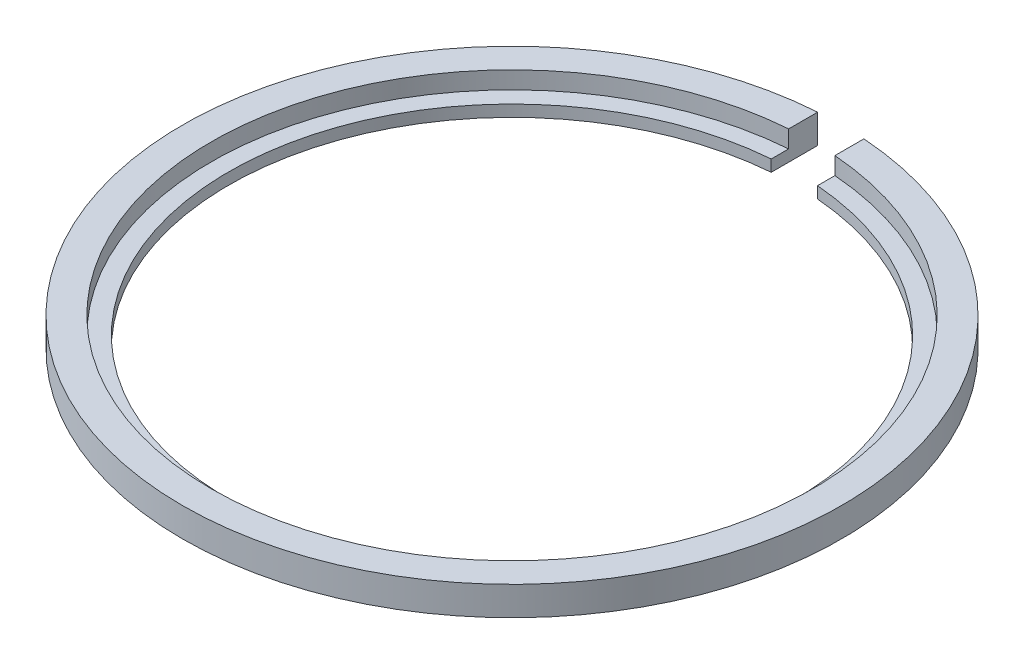
ISO-10303-21;
HEADER;
FILE_DESCRIPTION(('STEP AP214'),'2;1');
FILE_NAME('part.step','',(''),(''),'','','');
FILE_SCHEMA(('AUTOMOTIVE_DESIGN { 1 0 10303 214 1 1 1 1 }'));
ENDSEC;
DATA;
#1=APPLICATION_CONTEXT('core data for automotive mechanical design processes');
#2=APPLICATION_PROTOCOL_DEFINITION('international standard','automotive_design',2000,#1);
#3=PRODUCT_CONTEXT('',#1,'mechanical');
#4=PRODUCT('Part','Part','',(#3));
#5=PRODUCT_RELATED_PRODUCT_CATEGORY('part','',(#4));
#6=PRODUCT_DEFINITION_FORMATION('','',#4);
#7=PRODUCT_DEFINITION_CONTEXT('part definition',#1,'design');
#8=PRODUCT_DEFINITION('design','',#6,#7);
#9=PRODUCT_DEFINITION_SHAPE('','',#8);
#10=(LENGTH_UNIT() NAMED_UNIT(*) SI_UNIT(.MILLI.,.METRE.));
#11=(NAMED_UNIT(*) PLANE_ANGLE_UNIT() SI_UNIT($,.RADIAN.));
#12=(NAMED_UNIT(*) SI_UNIT($,.STERADIAN.) SOLID_ANGLE_UNIT());
#13=UNCERTAINTY_MEASURE_WITH_UNIT(LENGTH_MEASURE(1.E-05),#10,'distance_accuracy_value','');
#14=(GEOMETRIC_REPRESENTATION_CONTEXT(3) GLOBAL_UNCERTAINTY_ASSIGNED_CONTEXT((#13)) GLOBAL_UNIT_ASSIGNED_CONTEXT((#10,
#11,#12)) REPRESENTATION_CONTEXT('',''));
#15=CARTESIAN_POINT('',(0.,0.,0.));
#16=DIRECTION('',(0.,0.,1.));
#17=DIRECTION('',(1.,0.,0.));
#18=AXIS2_PLACEMENT_3D('',#15,#16,#17);
#19=CARTESIAN_POINT('',(0.,27.2585381463305,0.));
#20=DIRECTION('',(0.,1.,0.));
#21=DIRECTION('',(0.,0.,1.));
#22=AXIS2_PLACEMENT_3D('',#19,#20,#21);
#23=CYLINDRICAL_SURFACE('',#22,24.5);
#24=CARTESIAN_POINT('',(0.,0.,0.));
#25=DIRECTION('',(0.,1.,0.));
#26=DIRECTION('',(0.,0.,1.));
#27=AXIS2_PLACEMENT_3D('',#24,#25,#26);
#28=CIRCLE('',#27,24.5);
#29=CARTESIAN_POINT('',(-2.00000000000002,0.,-24.4182308941496));
#30=VERTEX_POINT('',#29);
#31=CARTESIAN_POINT('',(2.,0.,-24.4182308941496));
#32=VERTEX_POINT('',#31);
#33=EDGE_CURVE('E98',#30,#32,#28,.T.);
#34=ORIENTED_EDGE('',*,*,#33,.F.);
#35=DIRECTION('',(0.,1.,0.));
#36=VECTOR('',#35,1.);
#37=CARTESIAN_POINT('',(-2.00000000000002,27.2585381463305,-24.4182308941496));
#38=LINE('',#37,#36);
#39=CARTESIAN_POINT('',(-2.00000000000002,1.,-24.4182308941496));
#40=VERTEX_POINT('',#39);
#41=EDGE_CURVE('E122',#30,#40,#38,.T.);
#42=ORIENTED_EDGE('',*,*,#41,.T.);
#43=CARTESIAN_POINT('',(0.,1.,0.));
#44=DIRECTION('',(0.,1.,0.));
#45=DIRECTION('',(0.,0.,1.));
#46=AXIS2_PLACEMENT_3D('',#43,#44,#45);
#47=CIRCLE('',#46,24.5);
#48=CARTESIAN_POINT('',(2.,1.,-24.4182308941496));
#49=VERTEX_POINT('',#48);
#50=EDGE_CURVE('E100',#40,#49,#47,.T.);
#51=ORIENTED_EDGE('',*,*,#50,.T.);
#52=DIRECTION('',(0.,1.,0.));
#53=VECTOR('',#52,1.);
#54=CARTESIAN_POINT('',(2.,27.2585381463305,-24.4182308941496));
#55=LINE('',#54,#53);
#56=EDGE_CURVE('E55',#32,#49,#55,.T.);
#57=ORIENTED_EDGE('',*,*,#56,.F.);
#58=EDGE_LOOP('',(#34,#42,#51,#57));
#59=FACE_BOUND('',#58,.T.);
#60=ADVANCED_FACE('F34',(#59),#23,.F.);
#61=CARTESIAN_POINT('',(24.5,0.,0.));
#62=DIRECTION('',(0.,1.,0.));
#63=DIRECTION('',(0.,0.,1.));
#64=AXIS2_PLACEMENT_3D('',#61,#62,#63);
#65=PLANE('',#64);
#66=CARTESIAN_POINT('',(0.,0.,0.));
#67=DIRECTION('',(0.,1.,0.));
#68=DIRECTION('',(0.,0.,1.));
#69=AXIS2_PLACEMENT_3D('',#66,#67,#68);
#70=CIRCLE('',#69,28.5);
#71=CARTESIAN_POINT('',(-2.00000000000002,0.,-28.429737951659));
#72=VERTEX_POINT('',#71);
#73=CARTESIAN_POINT('',(2.,0.,-28.429737951659));
#74=VERTEX_POINT('',#73);
#75=EDGE_CURVE('E105',#72,#74,#70,.T.);
#76=ORIENTED_EDGE('',*,*,#75,.F.);
#77=DIRECTION('',(0.,0.,-1.));
#78=VECTOR('',#77,1.);
#79=CARTESIAN_POINT('',(-2.00000000000002,0.,0.));
#80=LINE('',#79,#78);
#81=EDGE_CURVE('E92',#30,#72,#80,.T.);
#82=ORIENTED_EDGE('',*,*,#81,.F.);
#83=ORIENTED_EDGE('',*,*,#33,.T.);
#84=DIRECTION('',(0.,0.,-1.));
#85=VECTOR('',#84,1.);
#86=CARTESIAN_POINT('',(2.00000000000002,0.,0.));
#87=LINE('',#86,#85);
#88=EDGE_CURVE('E83',#32,#74,#87,.T.);
#89=ORIENTED_EDGE('',*,*,#88,.T.);
#90=EDGE_LOOP('',(#76,#82,#83,#89));
#91=FACE_BOUND('',#90,.T.);
#92=ADVANCED_FACE('F104',(#91),#65,.F.);
#93=CARTESIAN_POINT('',(0.,27.2585381463305,0.));
#94=DIRECTION('',(0.,1.,0.));
#95=DIRECTION('',(0.,0.,1.));
#96=AXIS2_PLACEMENT_3D('',#93,#94,#95);
#97=CYLINDRICAL_SURFACE('',#96,28.5);
#98=CARTESIAN_POINT('',(0.,2.5,0.));
#99=DIRECTION('',(0.,1.,0.));
#100=DIRECTION('',(0.,0.,1.));
#101=AXIS2_PLACEMENT_3D('',#98,#99,#100);
#102=CIRCLE('',#101,28.5);
#103=CARTESIAN_POINT('',(-2.00000000000002,2.5,-28.429737951659));
#104=VERTEX_POINT('',#103);
#105=CARTESIAN_POINT('',(2.,2.5,-28.429737951659));
#106=VERTEX_POINT('',#105);
#107=EDGE_CURVE('E107',#104,#106,#102,.T.);
#108=ORIENTED_EDGE('',*,*,#107,.F.);
#109=DIRECTION('',(0.,1.,0.));
#110=VECTOR('',#109,1.);
#111=CARTESIAN_POINT('',(-2.00000000000002,27.2585381463305,-28.429737951659));
#112=LINE('',#111,#110);
#113=EDGE_CURVE('E119',#104,#72,#112,.F.);
#114=ORIENTED_EDGE('',*,*,#113,.T.);
#115=ORIENTED_EDGE('',*,*,#75,.T.);
#116=DIRECTION('',(0.,1.,0.));
#117=VECTOR('',#116,1.);
#118=CARTESIAN_POINT('',(2.,27.2585381463305,-28.429737951659));
#119=LINE('',#118,#117);
#120=EDGE_CURVE('E86',#106,#74,#119,.F.);
#121=ORIENTED_EDGE('',*,*,#120,.F.);
#122=EDGE_LOOP('',(#108,#114,#115,#121));
#123=FACE_BOUND('',#122,.T.);
#124=ADVANCED_FACE('F137',(#123),#97,.T.);
#125=CARTESIAN_POINT('',(28.5,2.5,0.));
#126=DIRECTION('',(0.,-1.,0.));
#127=DIRECTION('',(0.,0.,-1.));
#128=AXIS2_PLACEMENT_3D('',#125,#126,#127);
#129=PLANE('',#128);
#130=CARTESIAN_POINT('',(0.,2.5,0.));
#131=DIRECTION('',(0.,1.,0.));
#132=DIRECTION('',(0.,0.,1.));
#133=AXIS2_PLACEMENT_3D('',#130,#131,#132);
#134=CIRCLE('',#133,26.);
#135=CARTESIAN_POINT('',(-2.00000000000002,2.5,-25.9229627936314));
#136=VERTEX_POINT('',#135);
#137=CARTESIAN_POINT('',(2.,2.5,-25.9229627936314));
#138=VERTEX_POINT('',#137);
#139=EDGE_CURVE('E112',#136,#138,#134,.T.);
#140=ORIENTED_EDGE('',*,*,#139,.F.);
#141=DIRECTION('',(0.,0.,-1.));
#142=VECTOR('',#141,1.);
#143=CARTESIAN_POINT('',(-2.00000000000002,2.5,0.));
#144=LINE('',#143,#142);
#145=EDGE_CURVE('E91',#136,#104,#144,.T.);
#146=ORIENTED_EDGE('',*,*,#145,.T.);
#147=ORIENTED_EDGE('',*,*,#107,.T.);
#148=DIRECTION('',(0.,0.,-1.));
#149=VECTOR('',#148,1.);
#150=CARTESIAN_POINT('',(2.00000000000002,2.5,0.));
#151=LINE('',#150,#149);
#152=EDGE_CURVE('E126',#138,#106,#151,.T.);
#153=ORIENTED_EDGE('',*,*,#152,.F.);
#154=EDGE_LOOP('',(#140,#146,#147,#153));
#155=FACE_BOUND('',#154,.T.);
#156=ADVANCED_FACE('F134',(#155),#129,.F.);
#157=CARTESIAN_POINT('',(0.,27.2585381463305,0.));
#158=DIRECTION('',(0.,1.,0.));
#159=DIRECTION('',(0.,0.,1.));
#160=AXIS2_PLACEMENT_3D('',#157,#158,#159);
#161=CYLINDRICAL_SURFACE('',#160,26.);
#162=CARTESIAN_POINT('',(0.,1.,0.));
#163=DIRECTION('',(0.,1.,0.));
#164=DIRECTION('',(0.,0.,1.));
#165=AXIS2_PLACEMENT_3D('',#162,#163,#164);
#166=CIRCLE('',#165,26.);
#167=CARTESIAN_POINT('',(-2.00000000000002,1.,-25.9229627936314));
#168=VERTEX_POINT('',#167);
#169=CARTESIAN_POINT('',(2.,1.,-25.9229627936314));
#170=VERTEX_POINT('',#169);
#171=EDGE_CURVE('E115',#168,#170,#166,.T.);
#172=ORIENTED_EDGE('',*,*,#171,.F.);
#173=DIRECTION('',(0.,1.,0.));
#174=VECTOR('',#173,1.);
#175=CARTESIAN_POINT('',(-2.00000000000002,27.2585381463305,-25.9229627936314));
#176=LINE('',#175,#174);
#177=EDGE_CURVE('E48',#168,#136,#176,.T.);
#178=ORIENTED_EDGE('',*,*,#177,.T.);
#179=ORIENTED_EDGE('',*,*,#139,.T.);
#180=DIRECTION('',(0.,1.,0.));
#181=VECTOR('',#180,1.);
#182=CARTESIAN_POINT('',(2.,27.2585381463305,-25.9229627936314));
#183=LINE('',#182,#181);
#184=EDGE_CURVE('E101',#170,#138,#183,.T.);
#185=ORIENTED_EDGE('',*,*,#184,.F.);
#186=EDGE_LOOP('',(#172,#178,#179,#185));
#187=FACE_BOUND('',#186,.T.);
#188=ADVANCED_FACE('F144',(#187),#161,.F.);
#189=CARTESIAN_POINT('',(26.,1.,0.));
#190=DIRECTION('',(0.,-1.,0.));
#191=DIRECTION('',(0.,0.,-1.));
#192=AXIS2_PLACEMENT_3D('',#189,#190,#191);
#193=PLANE('',#192);
#194=ORIENTED_EDGE('',*,*,#50,.F.);
#195=DIRECTION('',(0.,0.,-1.));
#196=VECTOR('',#195,1.);
#197=CARTESIAN_POINT('',(-2.00000000000002,1.,0.));
#198=LINE('',#197,#196);
#199=EDGE_CURVE('E11',#40,#168,#198,.T.);
#200=ORIENTED_EDGE('',*,*,#199,.T.);
#201=ORIENTED_EDGE('',*,*,#171,.T.);
#202=DIRECTION('',(0.,0.,-1.));
#203=VECTOR('',#202,1.);
#204=CARTESIAN_POINT('',(2.00000000000002,1.,0.));
#205=LINE('',#204,#203);
#206=EDGE_CURVE('E41',#49,#170,#205,.T.);
#207=ORIENTED_EDGE('',*,*,#206,.F.);
#208=EDGE_LOOP('',(#194,#200,#201,#207));
#209=FACE_BOUND('',#208,.T.);
#210=ADVANCED_FACE('F140',(#209),#193,.F.);
#211=CARTESIAN_POINT('',(2.00000000000002,2.5,0.));
#212=DIRECTION('',(-1.,0.,0.));
#213=DIRECTION('',(0.,0.,1.));
#214=AXIS2_PLACEMENT_3D('',#211,#212,#213);
#215=PLANE('',#214);
#216=ORIENTED_EDGE('',*,*,#120,.T.);
#217=ORIENTED_EDGE('',*,*,#88,.F.);
#218=ORIENTED_EDGE('',*,*,#56,.T.);
#219=ORIENTED_EDGE('',*,*,#206,.T.);
#220=ORIENTED_EDGE('',*,*,#184,.T.);
#221=ORIENTED_EDGE('',*,*,#152,.T.);
#222=EDGE_LOOP('',(#216,#217,#218,#219,#220,#221));
#223=FACE_BOUND('',#222,.T.);
#224=ADVANCED_FACE('F84',(#223),#215,.T.);
#225=CARTESIAN_POINT('',(-2.00000000000002,2.5,0.));
#226=DIRECTION('',(-1.,0.,0.));
#227=DIRECTION('',(0.,0.,1.));
#228=AXIS2_PLACEMENT_3D('',#225,#226,#227);
#229=PLANE('',#228);
#230=ORIENTED_EDGE('',*,*,#145,.F.);
#231=ORIENTED_EDGE('',*,*,#177,.F.);
#232=ORIENTED_EDGE('',*,*,#199,.F.);
#233=ORIENTED_EDGE('',*,*,#41,.F.);
#234=ORIENTED_EDGE('',*,*,#81,.T.);
#235=ORIENTED_EDGE('',*,*,#113,.F.);
#236=EDGE_LOOP('',(#230,#231,#232,#233,#234,#235));
#237=FACE_BOUND('',#236,.T.);
#238=ADVANCED_FACE('F138',(#237),#229,.F.);
#239=CLOSED_SHELL('',(#60,#92,#124,#156,#188,#210,#224,#238));
#240=MANIFOLD_SOLID_BREP('B2',#239);
#241=ADVANCED_BREP_SHAPE_REPRESENTATION('',(#18,#240),#14);
#242=SHAPE_DEFINITION_REPRESENTATION(#9,#241);
ENDSEC;
END-ISO-10303-21;
